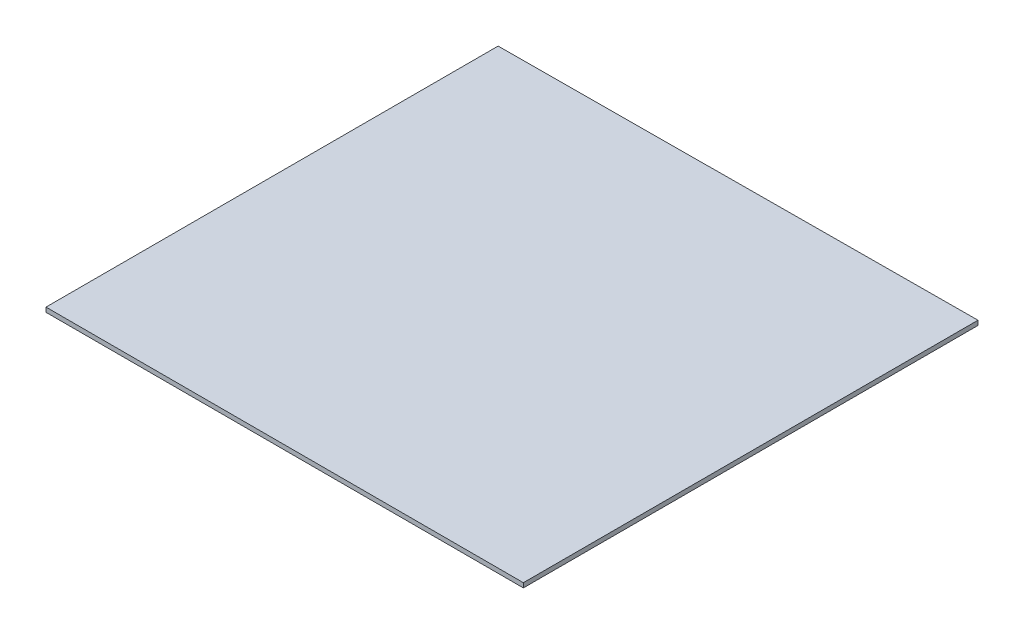
ISO-10303-21;
HEADER;
FILE_DESCRIPTION(('STEP AP214'),'2;1');
FILE_NAME('part.step','',(''),(''),'','','');
FILE_SCHEMA(('AUTOMOTIVE_DESIGN { 1 0 10303 214 1 1 1 1 }'));
ENDSEC;
DATA;
#1=APPLICATION_CONTEXT('core data for automotive mechanical design processes');
#2=APPLICATION_PROTOCOL_DEFINITION('international standard','automotive_design',2000,#1);
#3=PRODUCT_CONTEXT('',#1,'mechanical');
#4=PRODUCT('Part','Part','',(#3));
#5=PRODUCT_RELATED_PRODUCT_CATEGORY('part','',(#4));
#6=PRODUCT_DEFINITION_FORMATION('','',#4);
#7=PRODUCT_DEFINITION_CONTEXT('part definition',#1,'design');
#8=PRODUCT_DEFINITION('design','',#6,#7);
#9=PRODUCT_DEFINITION_SHAPE('','',#8);
#10=(LENGTH_UNIT() NAMED_UNIT(*) SI_UNIT(.MILLI.,.METRE.));
#11=(NAMED_UNIT(*) PLANE_ANGLE_UNIT() SI_UNIT($,.RADIAN.));
#12=(NAMED_UNIT(*) SI_UNIT($,.STERADIAN.) SOLID_ANGLE_UNIT());
#13=UNCERTAINTY_MEASURE_WITH_UNIT(LENGTH_MEASURE(1.E-05),#10,'distance_accuracy_value','');
#14=(GEOMETRIC_REPRESENTATION_CONTEXT(3) GLOBAL_UNCERTAINTY_ASSIGNED_CONTEXT((#13)) GLOBAL_UNIT_ASSIGNED_CONTEXT((#10,
#11,#12)) REPRESENTATION_CONTEXT('',''));
#15=CARTESIAN_POINT('',(0.,0.,0.));
#16=DIRECTION('',(0.,0.,1.));
#17=DIRECTION('',(1.,0.,0.));
#18=AXIS2_PLACEMENT_3D('',#15,#16,#17);
#19=CARTESIAN_POINT('',(0.,10.,0.));
#20=DIRECTION('',(-1.,0.,0.));
#21=DIRECTION('',(0.,0.,1.));
#22=AXIS2_PLACEMENT_3D('',#19,#20,#21);
#23=PLANE('',#22);
#24=DIRECTION('',(0.,1.,0.));
#25=VECTOR('',#24,1.);
#26=CARTESIAN_POINT('',(0.,10.,-64.8888930811945));
#27=LINE('',#26,#25);
#28=CARTESIAN_POINT('',(0.,10.,-64.8888930811945));
#29=VERTEX_POINT('',#28);
#30=CARTESIAN_POINT('',(0.,10.2,-64.8888930811945));
#31=VERTEX_POINT('',#30);
#32=EDGE_CURVE('E11',#29,#31,#27,.T.);
#33=ORIENTED_EDGE('',*,*,#32,.F.);
#34=DIRECTION('',(0.,0.,1.));
#35=VECTOR('',#34,1.);
#36=CARTESIAN_POINT('',(0.,10.,0.));
#37=LINE('',#36,#35);
#38=CARTESIAN_POINT('',(0.,10.,-45.));
#39=VERTEX_POINT('',#38);
#40=EDGE_CURVE('E88',#29,#39,#37,.T.);
#41=ORIENTED_EDGE('',*,*,#40,.T.);
#42=DIRECTION('',(0.,1.,0.));
#43=VECTOR('',#42,1.);
#44=CARTESIAN_POINT('',(0.,10.,-45.));
#45=LINE('',#44,#43);
#46=CARTESIAN_POINT('',(0.,10.2,-45.));
#47=VERTEX_POINT('',#46);
#48=EDGE_CURVE('E43',#39,#47,#45,.T.);
#49=ORIENTED_EDGE('',*,*,#48,.T.);
#50=DIRECTION('',(0.,0.,1.));
#51=VECTOR('',#50,1.);
#52=CARTESIAN_POINT('',(0.,10.2,0.));
#53=LINE('',#52,#51);
#54=EDGE_CURVE('E101',#31,#47,#53,.T.);
#55=ORIENTED_EDGE('',*,*,#54,.F.);
#56=EDGE_LOOP('',(#33,#41,#49,#55));
#57=FACE_BOUND('',#56,.T.);
#58=ADVANCED_FACE('F33',(#57),#23,.T.);
#59=CARTESIAN_POINT('',(0.,10.,-45.));
#60=DIRECTION('',(0.,0.,1.));
#61=DIRECTION('',(1.,0.,0.));
#62=AXIS2_PLACEMENT_3D('',#59,#60,#61);
#63=PLANE('',#62);
#64=ORIENTED_EDGE('',*,*,#48,.F.);
#65=DIRECTION('',(1.,0.,0.));
#66=VECTOR('',#65,1.);
#67=CARTESIAN_POINT('',(0.,10.,-45.));
#68=LINE('',#67,#66);
#69=CARTESIAN_POINT('',(21.,10.,-45.));
#70=VERTEX_POINT('',#69);
#71=EDGE_CURVE('E95',#70,#39,#68,.F.);
#72=ORIENTED_EDGE('',*,*,#71,.F.);
#73=DIRECTION('',(0.,1.,0.));
#74=VECTOR('',#73,1.);
#75=CARTESIAN_POINT('',(21.,10.,-45.));
#76=LINE('',#75,#74);
#77=CARTESIAN_POINT('',(21.,10.2,-45.));
#78=VERTEX_POINT('',#77);
#79=EDGE_CURVE('E51',#70,#78,#76,.T.);
#80=ORIENTED_EDGE('',*,*,#79,.T.);
#81=DIRECTION('',(1.,0.,0.));
#82=VECTOR('',#81,1.);
#83=CARTESIAN_POINT('',(0.,10.2,-45.));
#84=LINE('',#83,#82);
#85=EDGE_CURVE('E82',#78,#47,#84,.F.);
#86=ORIENTED_EDGE('',*,*,#85,.T.);
#87=EDGE_LOOP('',(#64,#72,#80,#86));
#88=FACE_BOUND('',#87,.T.);
#89=ADVANCED_FACE('F105',(#88),#63,.T.);
#90=CARTESIAN_POINT('',(21.,10.,0.));
#91=DIRECTION('',(-1.,0.,0.));
#92=DIRECTION('',(0.,0.,1.));
#93=AXIS2_PLACEMENT_3D('',#90,#91,#92);
#94=PLANE('',#93);
#95=ORIENTED_EDGE('',*,*,#79,.F.);
#96=DIRECTION('',(0.,0.,1.));
#97=VECTOR('',#96,1.);
#98=CARTESIAN_POINT('',(21.,10.,0.));
#99=LINE('',#98,#97);
#100=CARTESIAN_POINT('',(21.,10.,-65.));
#101=VERTEX_POINT('',#100);
#102=EDGE_CURVE('E87',#70,#101,#99,.F.);
#103=ORIENTED_EDGE('',*,*,#102,.T.);
#104=DIRECTION('',(0.,1.,0.));
#105=VECTOR('',#104,1.);
#106=CARTESIAN_POINT('',(21.,10.,-65.));
#107=LINE('',#106,#105);
#108=CARTESIAN_POINT('',(21.,10.2,-65.));
#109=VERTEX_POINT('',#108);
#110=EDGE_CURVE('E37',#101,#109,#107,.T.);
#111=ORIENTED_EDGE('',*,*,#110,.T.);
#112=DIRECTION('',(0.,0.,1.));
#113=VECTOR('',#112,1.);
#114=CARTESIAN_POINT('',(21.,10.2,0.));
#115=LINE('',#114,#113);
#116=EDGE_CURVE('E97',#78,#109,#115,.F.);
#117=ORIENTED_EDGE('',*,*,#116,.F.);
#118=EDGE_LOOP('',(#95,#103,#111,#117));
#119=FACE_BOUND('',#118,.T.);
#120=ADVANCED_FACE('F90',(#119),#94,.F.);
#121=CARTESIAN_POINT('',(-0.343304912611133,10.,-64.8870767216207));
#122=DIRECTION('',(-0.00529073160719021,0.,-0.999986003981586));
#123=DIRECTION('',(-0.999986003981586,0.,0.00529073160719021));
#124=AXIS2_PLACEMENT_3D('',#121,#122,#123);
#125=PLANE('',#124);
#126=DIRECTION('',(-0.999986003981586,0.,0.00529073160719021));
#127=VECTOR('',#126,1.);
#128=CARTESIAN_POINT('',(-0.343304912611133,10.,-64.8870767216207));
#129=LINE('',#128,#127);
#130=EDGE_CURVE('E76',#101,#29,#129,.T.);
#131=ORIENTED_EDGE('',*,*,#130,.T.);
#132=ORIENTED_EDGE('',*,*,#32,.T.);
#133=DIRECTION('',(-0.999986003981586,0.,0.00529073160719021));
#134=VECTOR('',#133,1.);
#135=CARTESIAN_POINT('',(-0.343304912611133,10.2,-64.8870767216207));
#136=LINE('',#135,#134);
#137=EDGE_CURVE('E78',#109,#31,#136,.T.);
#138=ORIENTED_EDGE('',*,*,#137,.F.);
#139=ORIENTED_EDGE('',*,*,#110,.F.);
#140=EDGE_LOOP('',(#131,#132,#138,#139));
#141=FACE_BOUND('',#140,.T.);
#142=ADVANCED_FACE('F35',(#141),#125,.T.);
#143=CARTESIAN_POINT('',(0.,10.2,0.));
#144=DIRECTION('',(0.,1.,0.));
#145=DIRECTION('',(0.,0.,1.));
#146=AXIS2_PLACEMENT_3D('',#143,#144,#145);
#147=PLANE('',#146);
#148=ORIENTED_EDGE('',*,*,#116,.T.);
#149=ORIENTED_EDGE('',*,*,#137,.T.);
#150=ORIENTED_EDGE('',*,*,#54,.T.);
#151=ORIENTED_EDGE('',*,*,#85,.F.);
#152=EDGE_LOOP('',(#148,#149,#150,#151));
#153=FACE_BOUND('',#152,.T.);
#154=ADVANCED_FACE('F104',(#153),#147,.T.);
#155=CARTESIAN_POINT('',(0.,10.,0.));
#156=DIRECTION('',(0.,1.,0.));
#157=DIRECTION('',(0.,0.,1.));
#158=AXIS2_PLACEMENT_3D('',#155,#156,#157);
#159=PLANE('',#158);
#160=ORIENTED_EDGE('',*,*,#102,.F.);
#161=ORIENTED_EDGE('',*,*,#71,.T.);
#162=ORIENTED_EDGE('',*,*,#40,.F.);
#163=ORIENTED_EDGE('',*,*,#130,.F.);
#164=EDGE_LOOP('',(#160,#161,#162,#163));
#165=FACE_BOUND('',#164,.T.);
#166=ADVANCED_FACE('F85',(#165),#159,.F.);
#167=CLOSED_SHELL('',(#58,#89,#120,#142,#154,#166));
#168=MANIFOLD_SOLID_BREP('B2',#167);
#169=ADVANCED_BREP_SHAPE_REPRESENTATION('',(#18,#168),#14);
#170=SHAPE_DEFINITION_REPRESENTATION(#9,#169);
ENDSEC;
END-ISO-10303-21;
